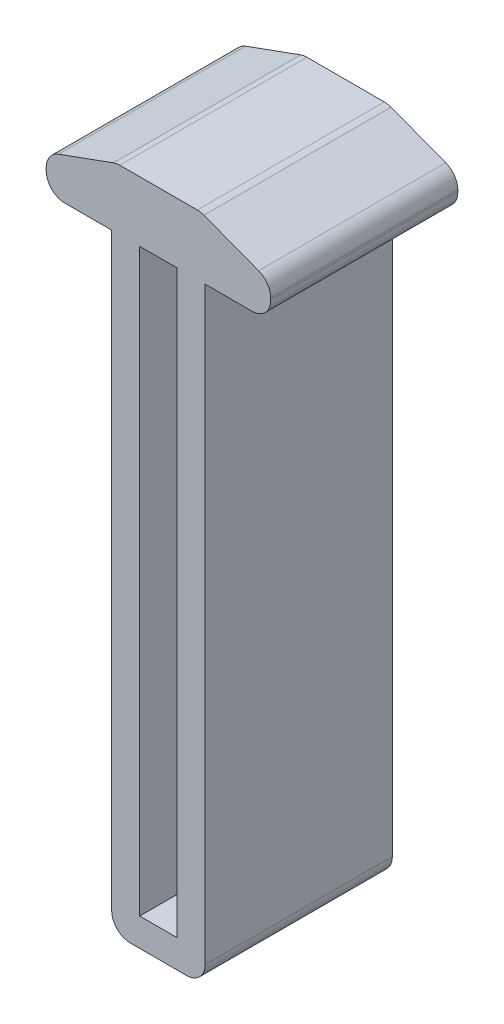
ISO-10303-21;
HEADER;
FILE_DESCRIPTION(('STEP AP214'),'2;1');
FILE_NAME('part.step','',(''),(''),'','','');
FILE_SCHEMA(('AUTOMOTIVE_DESIGN { 1 0 10303 214 1 1 1 1 }'));
ENDSEC;
DATA;
#1=APPLICATION_CONTEXT('core data for automotive mechanical design processes');
#2=APPLICATION_PROTOCOL_DEFINITION('international standard','automotive_design',2000,#1);
#3=PRODUCT_CONTEXT('',#1,'mechanical');
#4=PRODUCT('Part','Part','',(#3));
#5=PRODUCT_RELATED_PRODUCT_CATEGORY('part','',(#4));
#6=PRODUCT_DEFINITION_FORMATION('','',#4);
#7=PRODUCT_DEFINITION_CONTEXT('part definition',#1,'design');
#8=PRODUCT_DEFINITION('design','',#6,#7);
#9=PRODUCT_DEFINITION_SHAPE('','',#8);
#10=(LENGTH_UNIT() NAMED_UNIT(*) SI_UNIT(.MILLI.,.METRE.));
#11=(NAMED_UNIT(*) PLANE_ANGLE_UNIT() SI_UNIT($,.RADIAN.));
#12=(NAMED_UNIT(*) SI_UNIT($,.STERADIAN.) SOLID_ANGLE_UNIT());
#13=UNCERTAINTY_MEASURE_WITH_UNIT(LENGTH_MEASURE(1.E-05),#10,'distance_accuracy_value','');
#14=(GEOMETRIC_REPRESENTATION_CONTEXT(3) GLOBAL_UNCERTAINTY_ASSIGNED_CONTEXT((#13)) GLOBAL_UNIT_ASSIGNED_CONTEXT((#10,
#11,#12)) REPRESENTATION_CONTEXT('',''));
#15=CARTESIAN_POINT('',(0.,0.,0.));
#16=DIRECTION('',(0.,0.,1.));
#17=DIRECTION('',(1.,0.,0.));
#18=AXIS2_PLACEMENT_3D('',#15,#16,#17);
#19=CARTESIAN_POINT('',(0.,0.,10.));
#20=DIRECTION('',(0.,0.,1.));
#21=DIRECTION('',(1.,0.,0.));
#22=AXIS2_PLACEMENT_3D('',#19,#20,#21);
#23=PLANE('',#22);
#24=DIRECTION('',(0.,-1.,0.));
#25=VECTOR('',#24,1.);
#26=CARTESIAN_POINT('',(2.05141992083448,-32.5,10.));
#27=LINE('',#26,#25);
#28=CARTESIAN_POINT('',(2.05141992083448,0.,10.));
#29=VERTEX_POINT('',#28);
#30=CARTESIAN_POINT('',(2.05141992083448,-31.5,10.));
#31=VERTEX_POINT('',#30);
#32=EDGE_CURVE('E228',#29,#31,#27,.T.);
#33=ORIENTED_EDGE('',*,*,#32,.T.);
#34=CARTESIAN_POINT('',(3.05141992083448,-31.5,10.));
#35=DIRECTION('',(0.,0.,1.));
#36=DIRECTION('',(1.,0.,0.));
#37=AXIS2_PLACEMENT_3D('',#34,#35,#36);
#38=CIRCLE('',#37,1.);
#39=CARTESIAN_POINT('',(3.05141992083448,-32.5,10.));
#40=VERTEX_POINT('',#39);
#41=EDGE_CURVE('E320',#31,#40,#38,.T.);
#42=ORIENTED_EDGE('',*,*,#41,.T.);
#43=DIRECTION('',(1.,0.,0.));
#44=VECTOR('',#43,1.);
#45=CARTESIAN_POINT('',(7.05141992083449,-32.5,10.));
#46=LINE('',#45,#44);
#47=CARTESIAN_POINT('',(6.05141992083449,-32.5,10.));
#48=VERTEX_POINT('',#47);
#49=EDGE_CURVE('E232',#40,#48,#46,.T.);
#50=ORIENTED_EDGE('',*,*,#49,.T.);
#51=CARTESIAN_POINT('',(6.05141992083449,-31.5,10.));
#52=DIRECTION('',(0.,0.,1.));
#53=DIRECTION('',(1.,0.,0.));
#54=AXIS2_PLACEMENT_3D('',#51,#52,#53);
#55=CIRCLE('',#54,1.);
#56=CARTESIAN_POINT('',(7.05141992083449,-31.5,10.));
#57=VERTEX_POINT('',#56);
#58=EDGE_CURVE('E318',#48,#57,#55,.T.);
#59=ORIENTED_EDGE('',*,*,#58,.T.);
#60=DIRECTION('',(0.,1.,0.));
#61=VECTOR('',#60,1.);
#62=CARTESIAN_POINT('',(7.05141992083449,0.,10.));
#63=LINE('',#62,#61);
#64=CARTESIAN_POINT('',(7.05141992083449,0.,10.));
#65=VERTEX_POINT('',#64);
#66=EDGE_CURVE('E235',#57,#65,#63,.T.);
#67=ORIENTED_EDGE('',*,*,#66,.T.);
#68=DIRECTION('',(1.,0.,0.));
#69=VECTOR('',#68,1.);
#70=CARTESIAN_POINT('',(7.05141992083449,0.,10.));
#71=LINE('',#70,#69);
#72=CARTESIAN_POINT('',(9.55141992083448,0.,10.));
#73=VERTEX_POINT('',#72);
#74=EDGE_CURVE('E237',#65,#73,#71,.T.);
#75=ORIENTED_EDGE('',*,*,#74,.T.);
#76=CARTESIAN_POINT('',(9.55141992083448,0.999999999999999,10.));
#77=DIRECTION('',(0.,0.,1.));
#78=DIRECTION('',(1.,0.,0.));
#79=AXIS2_PLACEMENT_3D('',#76,#77,#78);
#80=CIRCLE('',#79,1.);
#81=CARTESIAN_POINT('',(10.5514199208345,0.999999999999999,10.));
#82=VERTEX_POINT('',#81);
#83=EDGE_CURVE('E314',#73,#82,#80,.T.);
#84=ORIENTED_EDGE('',*,*,#83,.T.);
#85=DIRECTION('',(0.,1.,0.));
#86=VECTOR('',#85,1.);
#87=CARTESIAN_POINT('',(10.5514199208345,0.,10.));
#88=LINE('',#87,#86);
#89=CARTESIAN_POINT('',(10.5514199208345,1.11540034179503,10.));
#90=VERTEX_POINT('',#89);
#91=EDGE_CURVE('E240',#82,#90,#88,.T.);
#92=ORIENTED_EDGE('',*,*,#91,.T.);
#93=CARTESIAN_POINT('',(9.55141992083448,1.11540034179503,10.));
#94=DIRECTION('',(0.,0.,1.));
#95=DIRECTION('',(1.,0.,0.));
#96=AXIS2_PLACEMENT_3D('',#93,#94,#95);
#97=CIRCLE('',#96,1.);
#98=CARTESIAN_POINT('',(9.90586096085787,2.0504787070389,10.));
#99=VERTEX_POINT('',#98);
#100=EDGE_CURVE('E312',#90,#99,#97,.T.);
#101=ORIENTED_EDGE('',*,*,#100,.T.);
#102=DIRECTION('',(-0.935078365243865,0.354441040023388,0.));
#103=VECTOR('',#102,1.);
#104=CARTESIAN_POINT('',(10.5514199208345,1.8057798692994,10.));
#105=LINE('',#104,#103);
#106=CARTESIAN_POINT('',(6.98238125380704,3.15862239463681,10.));
#107=VERTEX_POINT('',#106);
#108=EDGE_CURVE('E243',#99,#107,#105,.T.);
#109=ORIENTED_EDGE('',*,*,#108,.T.);
#110=CARTESIAN_POINT('',(6.62794021378365,2.22354402939295,10.));
#111=DIRECTION('',(0.,0.,1.));
#112=DIRECTION('',(1.,0.,0.));
#113=AXIS2_PLACEMENT_3D('',#110,#111,#112);
#114=CIRCLE('',#113,1.);
#115=CARTESIAN_POINT('',(6.62794021378365,3.22354402939295,10.));
#116=VERTEX_POINT('',#115);
#117=EDGE_CURVE('E310',#107,#116,#114,.T.);
#118=ORIENTED_EDGE('',*,*,#117,.T.);
#119=DIRECTION('',(-1.,0.,0.));
#120=VECTOR('',#119,1.);
#121=CARTESIAN_POINT('',(6.81110645985902,3.22354402939295,10.));
#122=LINE('',#121,#120);
#123=CARTESIAN_POINT('',(2.48708793758452,3.22354402939295,10.));
#124=VERTEX_POINT('',#123);
#125=EDGE_CURVE('E246',#116,#124,#122,.T.);
#126=ORIENTED_EDGE('',*,*,#125,.T.);
#127=CARTESIAN_POINT('',(2.48708793758452,2.22354402939295,10.));
#128=DIRECTION('',(0.,0.,1.));
#129=DIRECTION('',(1.,0.,0.));
#130=AXIS2_PLACEMENT_3D('',#127,#128,#129);
#131=CIRCLE('',#130,1.);
#132=CARTESIAN_POINT('',(2.14569766162846,3.16346566414908,10.));
#133=VERTEX_POINT('',#132);
#134=EDGE_CURVE('E308',#124,#133,#131,.T.);
#135=ORIENTED_EDGE('',*,*,#134,.T.);
#136=DIRECTION('',(-0.939921634756133,-0.341390275956066,0.));
#137=VECTOR('',#136,1.);
#138=CARTESIAN_POINT('',(2.31110645985902,3.22354402939295,10.));
#139=LINE('',#138,#137);
#140=CARTESIAN_POINT('',(-0.789970355121582,2.09719750168283,10.));
#141=VERTEX_POINT('',#140);
#142=EDGE_CURVE('E249',#133,#141,#139,.T.);
#143=ORIENTED_EDGE('',*,*,#142,.T.);
#144=CARTESIAN_POINT('',(-0.448580079165516,1.1572758669267,10.));
#145=DIRECTION('',(0.,0.,1.));
#146=DIRECTION('',(1.,0.,0.));
#147=AXIS2_PLACEMENT_3D('',#144,#145,#146);
#148=CIRCLE('',#147,1.);
#149=CARTESIAN_POINT('',(-1.44858007916552,1.1572758669267,10.));
#150=VERTEX_POINT('',#149);
#151=EDGE_CURVE('E55',#141,#150,#148,.T.);
#152=ORIENTED_EDGE('',*,*,#151,.T.);
#153=DIRECTION('',(0.,-1.,0.));
#154=VECTOR('',#153,1.);
#155=CARTESIAN_POINT('',(-1.44858007916552,1.85798292556868,10.));
#156=LINE('',#155,#154);
#157=CARTESIAN_POINT('',(-1.44858007916552,1.,10.));
#158=VERTEX_POINT('',#157);
#159=EDGE_CURVE('E251',#150,#158,#156,.T.);
#160=ORIENTED_EDGE('',*,*,#159,.T.);
#161=CARTESIAN_POINT('',(-0.448580079165516,1.,10.));
#162=DIRECTION('',(0.,0.,1.));
#163=DIRECTION('',(1.,0.,0.));
#164=AXIS2_PLACEMENT_3D('',#161,#162,#163);
#165=CIRCLE('',#164,1.);
#166=CARTESIAN_POINT('',(-0.448580079165516,0.,10.));
#167=VERTEX_POINT('',#166);
#168=EDGE_CURVE('E316',#158,#167,#165,.T.);
#169=ORIENTED_EDGE('',*,*,#168,.T.);
#170=DIRECTION('',(1.,0.,0.));
#171=VECTOR('',#170,1.);
#172=CARTESIAN_POINT('',(-1.44858007916552,0.,10.));
#173=LINE('',#172,#171);
#174=EDGE_CURVE('E226',#167,#29,#173,.T.);
#175=ORIENTED_EDGE('',*,*,#174,.T.);
#176=EDGE_LOOP('',(#33,#42,#50,#59,#67,#75,#84,#92,#101,#109,#118,#126,#135,#143,#152,#160,#169,#175));
#177=FACE_BOUND('',#176,.T.);
#178=DIRECTION('',(0.,-1.,0.));
#179=VECTOR('',#178,1.);
#180=CARTESIAN_POINT('',(3.55141992083448,0.,10.));
#181=LINE('',#180,#179);
#182=CARTESIAN_POINT('',(3.55141992083448,0.,10.));
#183=VERTEX_POINT('',#182);
#184=CARTESIAN_POINT('',(3.55141992083448,-31.,10.));
#185=VERTEX_POINT('',#184);
#186=EDGE_CURVE('E195',#183,#185,#181,.T.);
#187=ORIENTED_EDGE('',*,*,#186,.F.);
#188=DIRECTION('',(-1.,0.,0.));
#189=VECTOR('',#188,1.);
#190=CARTESIAN_POINT('',(3.55141992083448,0.,10.));
#191=LINE('',#190,#189);
#192=CARTESIAN_POINT('',(5.55141992083448,0.,10.));
#193=VERTEX_POINT('',#192);
#194=EDGE_CURVE('E185',#193,#183,#191,.T.);
#195=ORIENTED_EDGE('',*,*,#194,.F.);
#196=DIRECTION('',(0.,1.,0.));
#197=VECTOR('',#196,1.);
#198=CARTESIAN_POINT('',(5.55141992083448,-31.,10.));
#199=LINE('',#198,#197);
#200=CARTESIAN_POINT('',(5.55141992083448,-31.,10.));
#201=VERTEX_POINT('',#200);
#202=EDGE_CURVE('E210',#201,#193,#199,.T.);
#203=ORIENTED_EDGE('',*,*,#202,.F.);
#204=DIRECTION('',(1.,0.,0.));
#205=VECTOR('',#204,1.);
#206=CARTESIAN_POINT('',(3.55141992083448,-31.,10.));
#207=LINE('',#206,#205);
#208=EDGE_CURVE('E208',#185,#201,#207,.T.);
#209=ORIENTED_EDGE('',*,*,#208,.F.);
#210=EDGE_LOOP('',(#187,#195,#203,#209));
#211=FACE_BOUND('',#210,.T.);
#212=ADVANCED_FACE('F33',(#177,#211),#23,.T.);
#213=CARTESIAN_POINT('',(0.,0.,0.));
#214=DIRECTION('',(0.,0.,1.));
#215=DIRECTION('',(1.,0.,0.));
#216=AXIS2_PLACEMENT_3D('',#213,#214,#215);
#217=PLANE('',#216);
#218=DIRECTION('',(1.,0.,0.));
#219=VECTOR('',#218,1.);
#220=CARTESIAN_POINT('',(7.05141992083449,-32.5,0.));
#221=LINE('',#220,#219);
#222=CARTESIAN_POINT('',(3.05141992083448,-32.5,0.));
#223=VERTEX_POINT('',#222);
#224=CARTESIAN_POINT('',(6.05141992083449,-32.5,0.));
#225=VERTEX_POINT('',#224);
#226=EDGE_CURVE('E258',#223,#225,#221,.T.);
#227=ORIENTED_EDGE('',*,*,#226,.F.);
#228=CARTESIAN_POINT('',(3.05141992083448,-31.5,0.));
#229=DIRECTION('',(0.,0.,1.));
#230=DIRECTION('',(1.,0.,0.));
#231=AXIS2_PLACEMENT_3D('',#228,#229,#230);
#232=CIRCLE('',#231,1.);
#233=CARTESIAN_POINT('',(2.05141992083448,-31.5,0.));
#234=VERTEX_POINT('',#233);
#235=EDGE_CURVE('E303',#223,#234,#232,.F.);
#236=ORIENTED_EDGE('',*,*,#235,.T.);
#237=DIRECTION('',(0.,-1.,0.));
#238=VECTOR('',#237,1.);
#239=CARTESIAN_POINT('',(2.05141992083448,-32.5,0.));
#240=LINE('',#239,#238);
#241=CARTESIAN_POINT('',(2.05141992083448,0.,0.));
#242=VERTEX_POINT('',#241);
#243=EDGE_CURVE('E255',#242,#234,#240,.T.);
#244=ORIENTED_EDGE('',*,*,#243,.F.);
#245=DIRECTION('',(1.,0.,0.));
#246=VECTOR('',#245,1.);
#247=CARTESIAN_POINT('',(-1.44858007916552,0.,0.));
#248=LINE('',#247,#246);
#249=CARTESIAN_POINT('',(-0.448580079165516,0.,0.));
#250=VERTEX_POINT('',#249);
#251=EDGE_CURVE('E203',#250,#242,#248,.T.);
#252=ORIENTED_EDGE('',*,*,#251,.F.);
#253=CARTESIAN_POINT('',(-0.448580079165516,1.,0.));
#254=DIRECTION('',(0.,0.,1.));
#255=DIRECTION('',(1.,0.,0.));
#256=AXIS2_PLACEMENT_3D('',#253,#254,#255);
#257=CIRCLE('',#256,1.);
#258=CARTESIAN_POINT('',(-1.44858007916552,1.,0.));
#259=VERTEX_POINT('',#258);
#260=EDGE_CURVE('E299',#250,#259,#257,.F.);
#261=ORIENTED_EDGE('',*,*,#260,.T.);
#262=DIRECTION('',(0.,-1.,0.));
#263=VECTOR('',#262,1.);
#264=CARTESIAN_POINT('',(-1.44858007916552,1.85798292556868,0.));
#265=LINE('',#264,#263);
#266=CARTESIAN_POINT('',(-1.44858007916552,1.1572758669267,0.));
#267=VERTEX_POINT('',#266);
#268=EDGE_CURVE('E229',#267,#259,#265,.T.);
#269=ORIENTED_EDGE('',*,*,#268,.F.);
#270=CARTESIAN_POINT('',(-0.448580079165516,1.1572758669267,0.));
#271=DIRECTION('',(0.,0.,1.));
#272=DIRECTION('',(1.,0.,0.));
#273=AXIS2_PLACEMENT_3D('',#270,#271,#272);
#274=CIRCLE('',#273,1.);
#275=CARTESIAN_POINT('',(-0.789970355121582,2.09719750168283,0.));
#276=VERTEX_POINT('',#275);
#277=EDGE_CURVE('E289',#267,#276,#274,.F.);
#278=ORIENTED_EDGE('',*,*,#277,.T.);
#279=DIRECTION('',(-0.939921634756133,-0.341390275956066,0.));
#280=VECTOR('',#279,1.);
#281=CARTESIAN_POINT('',(2.31110645985902,3.22354402939295,0.));
#282=LINE('',#281,#280);
#283=CARTESIAN_POINT('',(2.14569766162846,3.16346566414908,0.));
#284=VERTEX_POINT('',#283);
#285=EDGE_CURVE('E275',#284,#276,#282,.T.);
#286=ORIENTED_EDGE('',*,*,#285,.F.);
#287=CARTESIAN_POINT('',(2.48708793758452,2.22354402939295,0.));
#288=DIRECTION('',(0.,0.,1.));
#289=DIRECTION('',(1.,0.,0.));
#290=AXIS2_PLACEMENT_3D('',#287,#288,#289);
#291=CIRCLE('',#290,1.);
#292=CARTESIAN_POINT('',(2.48708793758452,3.22354402939295,0.));
#293=VERTEX_POINT('',#292);
#294=EDGE_CURVE('E291',#284,#293,#291,.F.);
#295=ORIENTED_EDGE('',*,*,#294,.T.);
#296=DIRECTION('',(-1.,0.,0.));
#297=VECTOR('',#296,1.);
#298=CARTESIAN_POINT('',(6.81110645985902,3.22354402939295,0.));
#299=LINE('',#298,#297);
#300=CARTESIAN_POINT('',(6.62794021378365,3.22354402939295,0.));
#301=VERTEX_POINT('',#300);
#302=EDGE_CURVE('E272',#301,#293,#299,.T.);
#303=ORIENTED_EDGE('',*,*,#302,.F.);
#304=CARTESIAN_POINT('',(6.62794021378365,2.22354402939295,0.));
#305=DIRECTION('',(0.,0.,1.));
#306=DIRECTION('',(1.,0.,0.));
#307=AXIS2_PLACEMENT_3D('',#304,#305,#306);
#308=CIRCLE('',#307,1.);
#309=CARTESIAN_POINT('',(6.98238125380704,3.15862239463681,0.));
#310=VERTEX_POINT('',#309);
#311=EDGE_CURVE('E293',#301,#310,#308,.F.);
#312=ORIENTED_EDGE('',*,*,#311,.T.);
#313=DIRECTION('',(-0.935078365243865,0.354441040023388,0.));
#314=VECTOR('',#313,1.);
#315=CARTESIAN_POINT('',(10.5514199208345,1.8057798692994,0.));
#316=LINE('',#315,#314);
#317=CARTESIAN_POINT('',(9.90586096085787,2.0504787070389,0.));
#318=VERTEX_POINT('',#317);
#319=EDGE_CURVE('E269',#318,#310,#316,.T.);
#320=ORIENTED_EDGE('',*,*,#319,.F.);
#321=CARTESIAN_POINT('',(9.55141992083448,1.11540034179503,0.));
#322=DIRECTION('',(0.,0.,1.));
#323=DIRECTION('',(1.,0.,0.));
#324=AXIS2_PLACEMENT_3D('',#321,#322,#323);
#325=CIRCLE('',#324,1.);
#326=CARTESIAN_POINT('',(10.5514199208345,1.11540034179503,0.));
#327=VERTEX_POINT('',#326);
#328=EDGE_CURVE('E295',#318,#327,#325,.F.);
#329=ORIENTED_EDGE('',*,*,#328,.T.);
#330=DIRECTION('',(0.,1.,0.));
#331=VECTOR('',#330,1.);
#332=CARTESIAN_POINT('',(10.5514199208345,0.,0.));
#333=LINE('',#332,#331);
#334=CARTESIAN_POINT('',(10.5514199208345,0.999999999999999,0.));
#335=VERTEX_POINT('',#334);
#336=EDGE_CURVE('E266',#335,#327,#333,.T.);
#337=ORIENTED_EDGE('',*,*,#336,.F.);
#338=CARTESIAN_POINT('',(9.55141992083448,0.999999999999999,0.));
#339=DIRECTION('',(0.,0.,1.));
#340=DIRECTION('',(1.,0.,0.));
#341=AXIS2_PLACEMENT_3D('',#338,#339,#340);
#342=CIRCLE('',#341,1.);
#343=CARTESIAN_POINT('',(9.55141992083448,0.,0.));
#344=VERTEX_POINT('',#343);
#345=EDGE_CURVE('E297',#335,#344,#342,.F.);
#346=ORIENTED_EDGE('',*,*,#345,.T.);
#347=DIRECTION('',(1.,0.,0.));
#348=VECTOR('',#347,1.);
#349=CARTESIAN_POINT('',(7.05141992083449,0.,0.));
#350=LINE('',#349,#348);
#351=CARTESIAN_POINT('',(7.05141992083449,0.,0.));
#352=VERTEX_POINT('',#351);
#353=EDGE_CURVE('E263',#352,#344,#350,.T.);
#354=ORIENTED_EDGE('',*,*,#353,.F.);
#355=DIRECTION('',(0.,1.,0.));
#356=VECTOR('',#355,1.);
#357=CARTESIAN_POINT('',(7.05141992083449,0.,0.));
#358=LINE('',#357,#356);
#359=CARTESIAN_POINT('',(7.05141992083449,-31.5,0.));
#360=VERTEX_POINT('',#359);
#361=EDGE_CURVE('E261',#360,#352,#358,.T.);
#362=ORIENTED_EDGE('',*,*,#361,.F.);
#363=CARTESIAN_POINT('',(6.05141992083449,-31.5,0.));
#364=DIRECTION('',(0.,0.,1.));
#365=DIRECTION('',(1.,0.,0.));
#366=AXIS2_PLACEMENT_3D('',#363,#364,#365);
#367=CIRCLE('',#366,1.);
#368=EDGE_CURVE('E301',#360,#225,#367,.F.);
#369=ORIENTED_EDGE('',*,*,#368,.T.);
#370=EDGE_LOOP('',(#227,#236,#244,#252,#261,#269,#278,#286,#295,#303,#312,#320,#329,#337,#346,
#354,#362,#369));
#371=FACE_BOUND('',#370,.T.);
#372=DIRECTION('',(-1.,0.,0.));
#373=VECTOR('',#372,1.);
#374=CARTESIAN_POINT('',(3.55141992083448,0.,0.));
#375=LINE('',#374,#373);
#376=CARTESIAN_POINT('',(5.55141992083448,0.,0.));
#377=VERTEX_POINT('',#376);
#378=CARTESIAN_POINT('',(3.55141992083448,0.,0.));
#379=VERTEX_POINT('',#378);
#380=EDGE_CURVE('E214',#377,#379,#375,.T.);
#381=ORIENTED_EDGE('',*,*,#380,.T.);
#382=DIRECTION('',(0.,-1.,0.));
#383=VECTOR('',#382,1.);
#384=CARTESIAN_POINT('',(3.55141992083448,0.,0.));
#385=LINE('',#384,#383);
#386=CARTESIAN_POINT('',(3.55141992083448,-31.,0.));
#387=VERTEX_POINT('',#386);
#388=EDGE_CURVE('E202',#379,#387,#385,.T.);
#389=ORIENTED_EDGE('',*,*,#388,.T.);
#390=DIRECTION('',(1.,0.,0.));
#391=VECTOR('',#390,1.);
#392=CARTESIAN_POINT('',(3.55141992083448,-31.,0.));
#393=LINE('',#392,#391);
#394=CARTESIAN_POINT('',(5.55141992083448,-31.,0.));
#395=VERTEX_POINT('',#394);
#396=EDGE_CURVE('E217',#387,#395,#393,.T.);
#397=ORIENTED_EDGE('',*,*,#396,.T.);
#398=DIRECTION('',(0.,1.,0.));
#399=VECTOR('',#398,1.);
#400=CARTESIAN_POINT('',(5.55141992083448,-31.,0.));
#401=LINE('',#400,#399);
#402=EDGE_CURVE('E196',#395,#377,#401,.T.);
#403=ORIENTED_EDGE('',*,*,#402,.T.);
#404=EDGE_LOOP('',(#381,#389,#397,#403));
#405=FACE_BOUND('',#404,.T.);
#406=ADVANCED_FACE('F361',(#371,#405),#217,.F.);
#407=CARTESIAN_POINT('',(-1.44858007916552,0.,10.));
#408=DIRECTION('',(0.,1.,0.));
#409=DIRECTION('',(0.,0.,1.));
#410=AXIS2_PLACEMENT_3D('',#407,#408,#409);
#411=PLANE('',#410);
#412=ORIENTED_EDGE('',*,*,#174,.F.);
#413=DIRECTION('',(0.,0.,-1.));
#414=VECTOR('',#413,1.);
#415=CARTESIAN_POINT('',(-0.448580079165516,0.,10.));
#416=LINE('',#415,#414);
#417=EDGE_CURVE('E325',#167,#250,#416,.T.);
#418=ORIENTED_EDGE('',*,*,#417,.T.);
#419=ORIENTED_EDGE('',*,*,#251,.T.);
#420=DIRECTION('',(0.,0.,-1.));
#421=VECTOR('',#420,1.);
#422=CARTESIAN_POINT('',(2.05141992083448,0.,10.));
#423=LINE('',#422,#421);
#424=EDGE_CURVE('E281',#29,#242,#423,.T.);
#425=ORIENTED_EDGE('',*,*,#424,.F.);
#426=EDGE_LOOP('',(#412,#418,#419,#425));
#427=FACE_BOUND('',#426,.T.);
#428=ADVANCED_FACE('F371',(#427),#411,.F.);
#429=CARTESIAN_POINT('',(2.05141992083448,-32.5,10.));
#430=DIRECTION('',(1.,0.,0.));
#431=DIRECTION('',(0.,0.,-1.));
#432=AXIS2_PLACEMENT_3D('',#429,#430,#431);
#433=PLANE('',#432);
#434=ORIENTED_EDGE('',*,*,#243,.T.);
#435=DIRECTION('',(0.,0.,-1.));
#436=VECTOR('',#435,1.);
#437=CARTESIAN_POINT('',(2.05141992083448,-31.5,10.));
#438=LINE('',#437,#436);
#439=EDGE_CURVE('E305',#234,#31,#438,.F.);
#440=ORIENTED_EDGE('',*,*,#439,.T.);
#441=ORIENTED_EDGE('',*,*,#32,.F.);
#442=ORIENTED_EDGE('',*,*,#424,.T.);
#443=EDGE_LOOP('',(#434,#440,#441,#442));
#444=FACE_BOUND('',#443,.T.);
#445=ADVANCED_FACE('F376',(#444),#433,.F.);
#446=CARTESIAN_POINT('',(7.05141992083449,-32.5,10.));
#447=DIRECTION('',(0.,1.,0.));
#448=DIRECTION('',(0.,0.,1.));
#449=AXIS2_PLACEMENT_3D('',#446,#447,#448);
#450=PLANE('',#449);
#451=ORIENTED_EDGE('',*,*,#49,.F.);
#452=DIRECTION('',(0.,0.,-1.));
#453=VECTOR('',#452,1.);
#454=CARTESIAN_POINT('',(3.05141992083448,-32.5,10.));
#455=LINE('',#454,#453);
#456=EDGE_CURVE('E286',#40,#223,#455,.T.);
#457=ORIENTED_EDGE('',*,*,#456,.T.);
#458=ORIENTED_EDGE('',*,*,#226,.T.);
#459=DIRECTION('',(0.,0.,-1.));
#460=VECTOR('',#459,1.);
#461=CARTESIAN_POINT('',(6.05141992083449,-32.5,10.));
#462=LINE('',#461,#460);
#463=EDGE_CURVE('E284',#225,#48,#462,.F.);
#464=ORIENTED_EDGE('',*,*,#463,.T.);
#465=EDGE_LOOP('',(#451,#457,#458,#464));
#466=FACE_BOUND('',#465,.T.);
#467=ADVANCED_FACE('F384',(#466),#450,.F.);
#468=CARTESIAN_POINT('',(7.05141992083449,0.,10.));
#469=DIRECTION('',(-1.,0.,0.));
#470=DIRECTION('',(0.,-1.,0.));
#471=AXIS2_PLACEMENT_3D('',#468,#469,#470);
#472=PLANE('',#471);
#473=ORIENTED_EDGE('',*,*,#66,.F.);
#474=DIRECTION('',(0.,0.,-1.));
#475=VECTOR('',#474,1.);
#476=CARTESIAN_POINT('',(7.05141992083449,-31.5,10.));
#477=LINE('',#476,#475);
#478=EDGE_CURVE('E322',#57,#360,#477,.T.);
#479=ORIENTED_EDGE('',*,*,#478,.T.);
#480=ORIENTED_EDGE('',*,*,#361,.T.);
#481=DIRECTION('',(0.,0.,-1.));
#482=VECTOR('',#481,1.);
#483=CARTESIAN_POINT('',(7.05141992083449,0.,10.));
#484=LINE('',#483,#482);
#485=EDGE_CURVE('E253',#65,#352,#484,.T.);
#486=ORIENTED_EDGE('',*,*,#485,.F.);
#487=EDGE_LOOP('',(#473,#479,#480,#486));
#488=FACE_BOUND('',#487,.T.);
#489=ADVANCED_FACE('F392',(#488),#472,.F.);
#490=CARTESIAN_POINT('',(7.05141992083449,0.,10.));
#491=DIRECTION('',(0.,1.,0.));
#492=DIRECTION('',(0.,0.,1.));
#493=AXIS2_PLACEMENT_3D('',#490,#491,#492);
#494=PLANE('',#493);
#495=ORIENTED_EDGE('',*,*,#353,.T.);
#496=DIRECTION('',(0.,0.,-1.));
#497=VECTOR('',#496,1.);
#498=CARTESIAN_POINT('',(9.55141992083448,0.,10.));
#499=LINE('',#498,#497);
#500=EDGE_CURVE('E337',#344,#73,#499,.F.);
#501=ORIENTED_EDGE('',*,*,#500,.T.);
#502=ORIENTED_EDGE('',*,*,#74,.F.);
#503=ORIENTED_EDGE('',*,*,#485,.T.);
#504=EDGE_LOOP('',(#495,#501,#502,#503));
#505=FACE_BOUND('',#504,.T.);
#506=ADVANCED_FACE('F397',(#505),#494,.F.);
#507=CARTESIAN_POINT('',(10.5514199208345,0.,10.));
#508=DIRECTION('',(-1.,0.,0.));
#509=DIRECTION('',(0.,0.,1.));
#510=AXIS2_PLACEMENT_3D('',#507,#508,#509);
#511=PLANE('',#510);
#512=ORIENTED_EDGE('',*,*,#91,.F.);
#513=DIRECTION('',(0.,0.,-1.));
#514=VECTOR('',#513,1.);
#515=CARTESIAN_POINT('',(10.5514199208345,0.999999999999999,10.));
#516=LINE('',#515,#514);
#517=EDGE_CURVE('E334',#82,#335,#516,.T.);
#518=ORIENTED_EDGE('',*,*,#517,.T.);
#519=ORIENTED_EDGE('',*,*,#336,.T.);
#520=DIRECTION('',(0.,0.,-1.));
#521=VECTOR('',#520,1.);
#522=CARTESIAN_POINT('',(10.5514199208345,1.11540034179503,10.));
#523=LINE('',#522,#521);
#524=EDGE_CURVE('E332',#327,#90,#523,.F.);
#525=ORIENTED_EDGE('',*,*,#524,.T.);
#526=EDGE_LOOP('',(#512,#518,#519,#525));
#527=FACE_BOUND('',#526,.T.);
#528=ADVANCED_FACE('F406',(#527),#511,.F.);
#529=CARTESIAN_POINT('',(10.5514199208345,1.8057798692994,10.));
#530=DIRECTION('',(-0.354441040023388,-0.935078365243865,0.));
#531=DIRECTION('',(0.935078365243865,-0.354441040023388,0.));
#532=AXIS2_PLACEMENT_3D('',#529,#530,#531);
#533=PLANE('',#532);
#534=ORIENTED_EDGE('',*,*,#108,.F.);
#535=DIRECTION('',(0.,0.,-1.));
#536=VECTOR('',#535,1.);
#537=CARTESIAN_POINT('',(9.90586096085787,2.0504787070389,10.));
#538=LINE('',#537,#536);
#539=EDGE_CURVE('E341',#99,#318,#538,.T.);
#540=ORIENTED_EDGE('',*,*,#539,.T.);
#541=ORIENTED_EDGE('',*,*,#319,.T.);
#542=DIRECTION('',(0.,0.,-1.));
#543=VECTOR('',#542,1.);
#544=CARTESIAN_POINT('',(6.98238125380704,3.15862239463681,10.));
#545=LINE('',#544,#543);
#546=EDGE_CURVE('E339',#310,#107,#545,.F.);
#547=ORIENTED_EDGE('',*,*,#546,.T.);
#548=EDGE_LOOP('',(#534,#540,#541,#547));
#549=FACE_BOUND('',#548,.T.);
#550=ADVANCED_FACE('F415',(#549),#533,.F.);
#551=CARTESIAN_POINT('',(6.81110645985902,3.22354402939295,10.));
#552=DIRECTION('',(0.,-1.,0.));
#553=DIRECTION('',(1.,0.,0.));
#554=AXIS2_PLACEMENT_3D('',#551,#552,#553);
#555=PLANE('',#554);
#556=ORIENTED_EDGE('',*,*,#125,.F.);
#557=DIRECTION('',(0.,0.,-1.));
#558=VECTOR('',#557,1.);
#559=CARTESIAN_POINT('',(6.62794021378365,3.22354402939295,10.));
#560=LINE('',#559,#558);
#561=EDGE_CURVE('E346',#116,#301,#560,.T.);
#562=ORIENTED_EDGE('',*,*,#561,.T.);
#563=ORIENTED_EDGE('',*,*,#302,.T.);
#564=DIRECTION('',(0.,0.,-1.));
#565=VECTOR('',#564,1.);
#566=CARTESIAN_POINT('',(2.48708793758452,3.22354402939295,10.));
#567=LINE('',#566,#565);
#568=EDGE_CURVE('E344',#293,#124,#567,.F.);
#569=ORIENTED_EDGE('',*,*,#568,.T.);
#570=EDGE_LOOP('',(#556,#562,#563,#569));
#571=FACE_BOUND('',#570,.T.);
#572=ADVANCED_FACE('F424',(#571),#555,.F.);
#573=CARTESIAN_POINT('',(2.31110645985902,3.22354402939295,10.));
#574=DIRECTION('',(0.341390275956066,-0.939921634756133,0.));
#575=DIRECTION('',(0.939921634756133,0.341390275956066,0.));
#576=AXIS2_PLACEMENT_3D('',#573,#574,#575);
#577=PLANE('',#576);
#578=ORIENTED_EDGE('',*,*,#142,.F.);
#579=DIRECTION('',(0.,0.,-1.));
#580=VECTOR('',#579,1.);
#581=CARTESIAN_POINT('',(2.14569766162846,3.16346566414908,10.));
#582=LINE('',#581,#580);
#583=EDGE_CURVE('E11',#133,#284,#582,.T.);
#584=ORIENTED_EDGE('',*,*,#583,.T.);
#585=ORIENTED_EDGE('',*,*,#285,.T.);
#586=DIRECTION('',(0.,0.,-1.));
#587=VECTOR('',#586,1.);
#588=CARTESIAN_POINT('',(-0.789970355121581,2.09719750168283,10.));
#589=LINE('',#588,#587);
#590=EDGE_CURVE('E41',#276,#141,#589,.F.);
#591=ORIENTED_EDGE('',*,*,#590,.T.);
#592=EDGE_LOOP('',(#578,#584,#585,#591));
#593=FACE_BOUND('',#592,.T.);
#594=ADVANCED_FACE('F351',(#593),#577,.F.);
#595=CARTESIAN_POINT('',(-1.44858007916552,1.85798292556868,10.));
#596=DIRECTION('',(1.,0.,0.));
#597=DIRECTION('',(0.,1.,0.));
#598=AXIS2_PLACEMENT_3D('',#595,#596,#597);
#599=PLANE('',#598);
#600=ORIENTED_EDGE('',*,*,#268,.T.);
#601=DIRECTION('',(0.,0.,-1.));
#602=VECTOR('',#601,1.);
#603=CARTESIAN_POINT('',(-1.44858007916552,0.999999999999999,10.));
#604=LINE('',#603,#602);
#605=EDGE_CURVE('E48',#259,#158,#604,.F.);
#606=ORIENTED_EDGE('',*,*,#605,.T.);
#607=ORIENTED_EDGE('',*,*,#159,.F.);
#608=DIRECTION('',(0.,0.,-1.));
#609=VECTOR('',#608,1.);
#610=CARTESIAN_POINT('',(-1.44858007916552,1.1572758669267,10.));
#611=LINE('',#610,#609);
#612=EDGE_CURVE('E328',#150,#267,#611,.T.);
#613=ORIENTED_EDGE('',*,*,#612,.T.);
#614=EDGE_LOOP('',(#600,#606,#607,#613));
#615=FACE_BOUND('',#614,.T.);
#616=ADVANCED_FACE('F358',(#615),#599,.F.);
#617=CARTESIAN_POINT('',(3.55141992083448,0.,10.));
#618=DIRECTION('',(0.,-1.,0.));
#619=DIRECTION('',(0.,0.,-1.));
#620=AXIS2_PLACEMENT_3D('',#617,#618,#619);
#621=PLANE('',#620);
#622=ORIENTED_EDGE('',*,*,#380,.F.);
#623=DIRECTION('',(0.,0.,-1.));
#624=VECTOR('',#623,1.);
#625=CARTESIAN_POINT('',(5.55141992083448,0.,10.));
#626=LINE('',#625,#624);
#627=EDGE_CURVE('E191',#193,#377,#626,.T.);
#628=ORIENTED_EDGE('',*,*,#627,.F.);
#629=ORIENTED_EDGE('',*,*,#194,.T.);
#630=DIRECTION('',(0.,0.,-1.));
#631=VECTOR('',#630,1.);
#632=CARTESIAN_POINT('',(3.55141992083448,0.,10.));
#633=LINE('',#632,#631);
#634=EDGE_CURVE('E188',#183,#379,#633,.T.);
#635=ORIENTED_EDGE('',*,*,#634,.T.);
#636=EDGE_LOOP('',(#622,#628,#629,#635));
#637=FACE_BOUND('',#636,.T.);
#638=ADVANCED_FACE('F187',(#637),#621,.T.);
#639=CARTESIAN_POINT('',(3.55141992083448,0.,10.));
#640=DIRECTION('',(1.,0.,0.));
#641=DIRECTION('',(0.,1.,0.));
#642=AXIS2_PLACEMENT_3D('',#639,#640,#641);
#643=PLANE('',#642);
#644=ORIENTED_EDGE('',*,*,#388,.F.);
#645=ORIENTED_EDGE('',*,*,#634,.F.);
#646=ORIENTED_EDGE('',*,*,#186,.T.);
#647=DIRECTION('',(0.,0.,-1.));
#648=VECTOR('',#647,1.);
#649=CARTESIAN_POINT('',(3.55141992083448,-31.,10.));
#650=LINE('',#649,#648);
#651=EDGE_CURVE('E204',#185,#387,#650,.T.);
#652=ORIENTED_EDGE('',*,*,#651,.T.);
#653=EDGE_LOOP('',(#644,#645,#646,#652));
#654=FACE_BOUND('',#653,.T.);
#655=ADVANCED_FACE('F199',(#654),#643,.T.);
#656=CARTESIAN_POINT('',(3.55141992083448,-31.,10.));
#657=DIRECTION('',(0.,1.,0.));
#658=DIRECTION('',(0.,0.,1.));
#659=AXIS2_PLACEMENT_3D('',#656,#657,#658);
#660=PLANE('',#659);
#661=ORIENTED_EDGE('',*,*,#396,.F.);
#662=ORIENTED_EDGE('',*,*,#651,.F.);
#663=ORIENTED_EDGE('',*,*,#208,.T.);
#664=DIRECTION('',(0.,0.,-1.));
#665=VECTOR('',#664,1.);
#666=CARTESIAN_POINT('',(5.55141992083448,-31.,10.));
#667=LINE('',#666,#665);
#668=EDGE_CURVE('E223',#201,#395,#667,.T.);
#669=ORIENTED_EDGE('',*,*,#668,.T.);
#670=EDGE_LOOP('',(#661,#662,#663,#669));
#671=FACE_BOUND('',#670,.T.);
#672=ADVANCED_FACE('F523',(#671),#660,.T.);
#673=CARTESIAN_POINT('',(5.55141992083448,-31.,10.));
#674=DIRECTION('',(-1.,0.,0.));
#675=DIRECTION('',(0.,-1.,0.));
#676=AXIS2_PLACEMENT_3D('',#673,#674,#675);
#677=PLANE('',#676);
#678=ORIENTED_EDGE('',*,*,#402,.F.);
#679=ORIENTED_EDGE('',*,*,#668,.F.);
#680=ORIENTED_EDGE('',*,*,#202,.T.);
#681=ORIENTED_EDGE('',*,*,#627,.T.);
#682=EDGE_LOOP('',(#678,#679,#680,#681));
#683=FACE_BOUND('',#682,.T.);
#684=ADVANCED_FACE('F465',(#683),#677,.T.);
#685=CARTESIAN_POINT('',(3.05141992083448,-31.5,10.));
#686=DIRECTION('',(0.,0.,-1.));
#687=DIRECTION('',(-1.,0.,0.));
#688=AXIS2_PLACEMENT_3D('',#685,#686,#687);
#689=CYLINDRICAL_SURFACE('',#688,1.);
#690=ORIENTED_EDGE('',*,*,#41,.F.);
#691=ORIENTED_EDGE('',*,*,#439,.F.);
#692=ORIENTED_EDGE('',*,*,#235,.F.);
#693=ORIENTED_EDGE('',*,*,#456,.F.);
#694=EDGE_LOOP('',(#690,#691,#692,#693));
#695=FACE_BOUND('',#694,.T.);
#696=ADVANCED_FACE('F379',(#695),#689,.T.);
#697=CARTESIAN_POINT('',(6.05141992083449,-31.5,10.));
#698=DIRECTION('',(0.,0.,-1.));
#699=DIRECTION('',(-1.,0.,0.));
#700=AXIS2_PLACEMENT_3D('',#697,#698,#699);
#701=CYLINDRICAL_SURFACE('',#700,1.);
#702=ORIENTED_EDGE('',*,*,#58,.F.);
#703=ORIENTED_EDGE('',*,*,#463,.F.);
#704=ORIENTED_EDGE('',*,*,#368,.F.);
#705=ORIENTED_EDGE('',*,*,#478,.F.);
#706=EDGE_LOOP('',(#702,#703,#704,#705));
#707=FACE_BOUND('',#706,.T.);
#708=ADVANCED_FACE('F387',(#707),#701,.T.);
#709=CARTESIAN_POINT('',(-0.448580079165516,1.,10.));
#710=DIRECTION('',(0.,0.,-1.));
#711=DIRECTION('',(-1.,0.,0.));
#712=AXIS2_PLACEMENT_3D('',#709,#710,#711);
#713=CYLINDRICAL_SURFACE('',#712,1.);
#714=ORIENTED_EDGE('',*,*,#168,.F.);
#715=ORIENTED_EDGE('',*,*,#605,.F.);
#716=ORIENTED_EDGE('',*,*,#260,.F.);
#717=ORIENTED_EDGE('',*,*,#417,.F.);
#718=EDGE_LOOP('',(#714,#715,#716,#717));
#719=FACE_BOUND('',#718,.T.);
#720=ADVANCED_FACE('F368',(#719),#713,.T.);
#721=CARTESIAN_POINT('',(9.55141992083448,0.999999999999999,10.));
#722=DIRECTION('',(0.,0.,-1.));
#723=DIRECTION('',(-1.,0.,0.));
#724=AXIS2_PLACEMENT_3D('',#721,#722,#723);
#725=CYLINDRICAL_SURFACE('',#724,1.);
#726=ORIENTED_EDGE('',*,*,#83,.F.);
#727=ORIENTED_EDGE('',*,*,#500,.F.);
#728=ORIENTED_EDGE('',*,*,#345,.F.);
#729=ORIENTED_EDGE('',*,*,#517,.F.);
#730=EDGE_LOOP('',(#726,#727,#728,#729));
#731=FACE_BOUND('',#730,.T.);
#732=ADVANCED_FACE('F403',(#731),#725,.T.);
#733=CARTESIAN_POINT('',(9.55141992083448,1.11540034179503,10.));
#734=DIRECTION('',(0.,0.,-1.));
#735=DIRECTION('',(-1.,0.,0.));
#736=AXIS2_PLACEMENT_3D('',#733,#734,#735);
#737=CYLINDRICAL_SURFACE('',#736,1.);
#738=ORIENTED_EDGE('',*,*,#100,.F.);
#739=ORIENTED_EDGE('',*,*,#524,.F.);
#740=ORIENTED_EDGE('',*,*,#328,.F.);
#741=ORIENTED_EDGE('',*,*,#539,.F.);
#742=EDGE_LOOP('',(#738,#739,#740,#741));
#743=FACE_BOUND('',#742,.T.);
#744=ADVANCED_FACE('F412',(#743),#737,.T.);
#745=CARTESIAN_POINT('',(6.62794021378365,2.22354402939295,10.));
#746=DIRECTION('',(0.,0.,-1.));
#747=DIRECTION('',(-1.,0.,0.));
#748=AXIS2_PLACEMENT_3D('',#745,#746,#747);
#749=CYLINDRICAL_SURFACE('',#748,1.);
#750=ORIENTED_EDGE('',*,*,#117,.F.);
#751=ORIENTED_EDGE('',*,*,#546,.F.);
#752=ORIENTED_EDGE('',*,*,#311,.F.);
#753=ORIENTED_EDGE('',*,*,#561,.F.);
#754=EDGE_LOOP('',(#750,#751,#752,#753));
#755=FACE_BOUND('',#754,.T.);
#756=ADVANCED_FACE('F421',(#755),#749,.T.);
#757=CARTESIAN_POINT('',(2.48708793758452,2.22354402939295,10.));
#758=DIRECTION('',(0.,0.,-1.));
#759=DIRECTION('',(-1.,0.,0.));
#760=AXIS2_PLACEMENT_3D('',#757,#758,#759);
#761=CYLINDRICAL_SURFACE('',#760,1.);
#762=ORIENTED_EDGE('',*,*,#134,.F.);
#763=ORIENTED_EDGE('',*,*,#568,.F.);
#764=ORIENTED_EDGE('',*,*,#294,.F.);
#765=ORIENTED_EDGE('',*,*,#583,.F.);
#766=EDGE_LOOP('',(#762,#763,#764,#765));
#767=FACE_BOUND('',#766,.T.);
#768=ADVANCED_FACE('F427',(#767),#761,.T.);
#769=CARTESIAN_POINT('',(-0.448580079165516,1.1572758669267,10.));
#770=DIRECTION('',(0.,0.,-1.));
#771=DIRECTION('',(-1.,0.,0.));
#772=AXIS2_PLACEMENT_3D('',#769,#770,#771);
#773=CYLINDRICAL_SURFACE('',#772,1.);
#774=ORIENTED_EDGE('',*,*,#151,.F.);
#775=ORIENTED_EDGE('',*,*,#590,.F.);
#776=ORIENTED_EDGE('',*,*,#277,.F.);
#777=ORIENTED_EDGE('',*,*,#612,.F.);
#778=EDGE_LOOP('',(#774,#775,#776,#777));
#779=FACE_BOUND('',#778,.T.);
#780=ADVANCED_FACE('F35',(#779),#773,.T.);
#781=CLOSED_SHELL('',(#212,#406,#428,#445,#467,#489,#506,#528,#550,#572,#594,#616,#638,#655,
#672,#684,#696,#708,#720,#732,#744,#756,#768,#780));
#782=MANIFOLD_SOLID_BREP('B2',#781);
#783=ADVANCED_BREP_SHAPE_REPRESENTATION('',(#18,#782),#14);
#784=SHAPE_DEFINITION_REPRESENTATION(#9,#783);
ENDSEC;
END-ISO-10303-21;
